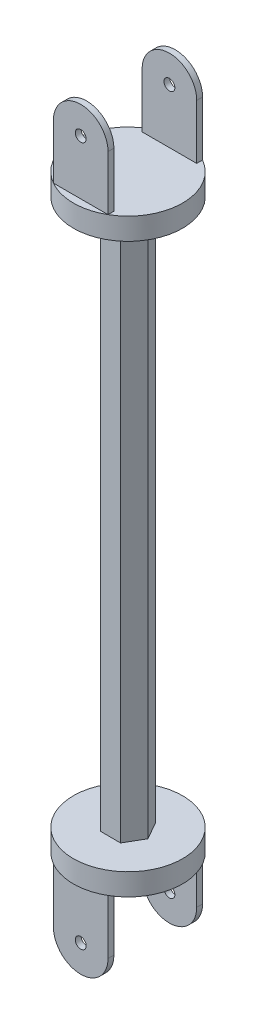
ISO-10303-21;
HEADER;
FILE_DESCRIPTION(('STEP AP214'),'2;1');
FILE_NAME('part.step','',(''),(''),'','','');
FILE_SCHEMA(('AUTOMOTIVE_DESIGN { 1 0 10303 214 1 1 1 1 }'));
ENDSEC;
DATA;
#1=APPLICATION_CONTEXT('core data for automotive mechanical design processes');
#2=APPLICATION_PROTOCOL_DEFINITION('international standard','automotive_design',2000,#1);
#3=PRODUCT_CONTEXT('',#1,'mechanical');
#4=PRODUCT('Part','Part','',(#3));
#5=PRODUCT_RELATED_PRODUCT_CATEGORY('part','',(#4));
#6=PRODUCT_DEFINITION_FORMATION('','',#4);
#7=PRODUCT_DEFINITION_CONTEXT('part definition',#1,'design');
#8=PRODUCT_DEFINITION('design','',#6,#7);
#9=PRODUCT_DEFINITION_SHAPE('','',#8);
#10=(LENGTH_UNIT() NAMED_UNIT(*) SI_UNIT(.MILLI.,.METRE.));
#11=(NAMED_UNIT(*) PLANE_ANGLE_UNIT() SI_UNIT($,.RADIAN.));
#12=(NAMED_UNIT(*) SI_UNIT($,.STERADIAN.) SOLID_ANGLE_UNIT());
#13=UNCERTAINTY_MEASURE_WITH_UNIT(LENGTH_MEASURE(1.E-05),#10,'distance_accuracy_value','');
#14=(GEOMETRIC_REPRESENTATION_CONTEXT(3) GLOBAL_UNCERTAINTY_ASSIGNED_CONTEXT((#13)) GLOBAL_UNIT_ASSIGNED_CONTEXT((#10,
#11,#12)) REPRESENTATION_CONTEXT('',''));
#15=CARTESIAN_POINT('',(0.,0.,0.));
#16=DIRECTION('',(0.,0.,1.));
#17=DIRECTION('',(1.,0.,0.));
#18=AXIS2_PLACEMENT_3D('',#15,#16,#17);
#19=CARTESIAN_POINT('',(0.,114.,-7.58489605585749));
#20=DIRECTION('',(0.,0.,1.));
#21=DIRECTION('',(1.,0.,0.));
#22=AXIS2_PLACEMENT_3D('',#19,#20,#21);
#23=CYLINDRICAL_SURFACE('',#22,5.);
#24=DIRECTION('',(0.,0.,-1.));
#25=VECTOR('',#24,1.);
#26=CARTESIAN_POINT('',(-5.,114.,-7.5848960558575));
#27=LINE('',#26,#25);
#28=CARTESIAN_POINT('',(-5.,114.,-7.58489605585749));
#29=VERTEX_POINT('',#28);
#30=CARTESIAN_POINT('',(-5.,114.,-8.66025403784439));
#31=VERTEX_POINT('',#30);
#32=EDGE_CURVE('E474',#29,#31,#27,.T.);
#33=ORIENTED_EDGE('',*,*,#32,.F.);
#34=CARTESIAN_POINT('',(0.,114.,-7.58489605585749));
#35=DIRECTION('',(0.,0.,-1.));
#36=DIRECTION('',(-1.,0.,0.));
#37=AXIS2_PLACEMENT_3D('',#34,#35,#36);
#38=CIRCLE('',#37,5.);
#39=CARTESIAN_POINT('',(5.,114.,-7.58489605585749));
#40=VERTEX_POINT('',#39);
#41=EDGE_CURVE('E56',#40,#29,#38,.F.);
#42=ORIENTED_EDGE('',*,*,#41,.F.);
#43=DIRECTION('',(0.,0.,-1.));
#44=VECTOR('',#43,1.);
#45=CARTESIAN_POINT('',(5.,114.,-7.5848960558575));
#46=LINE('',#45,#44);
#47=CARTESIAN_POINT('',(5.,114.,-8.66025403784439));
#48=VERTEX_POINT('',#47);
#49=EDGE_CURVE('E478',#48,#40,#46,.F.);
#50=ORIENTED_EDGE('',*,*,#49,.F.);
#51=CARTESIAN_POINT('',(0.,114.,-8.66025403784439));
#52=DIRECTION('',(0.,0.,1.));
#53=DIRECTION('',(1.,0.,0.));
#54=AXIS2_PLACEMENT_3D('',#51,#52,#53);
#55=CIRCLE('',#54,5.);
#56=EDGE_CURVE('E11',#31,#48,#55,.F.);
#57=ORIENTED_EDGE('',*,*,#56,.F.);
#58=EDGE_LOOP('',(#33,#42,#50,#57));
#59=FACE_BOUND('',#58,.T.);
#60=ADVANCED_FACE('F47',(#59),#23,.T.);
#61=CARTESIAN_POINT('',(0.,114.,8.66025403784439));
#62=DIRECTION('',(0.,0.,1.));
#63=DIRECTION('',(1.,0.,0.));
#64=AXIS2_PLACEMENT_3D('',#61,#62,#63);
#65=CYLINDRICAL_SURFACE('',#64,5.);
#66=DIRECTION('',(0.,0.,-1.));
#67=VECTOR('',#66,1.);
#68=CARTESIAN_POINT('',(-5.,114.,8.66025403784439));
#69=LINE('',#68,#67);
#70=CARTESIAN_POINT('',(-5.,114.,8.66025403784439));
#71=VERTEX_POINT('',#70);
#72=CARTESIAN_POINT('',(-5.,114.,7.58489605585749));
#73=VERTEX_POINT('',#72);
#74=EDGE_CURVE('E460',#71,#73,#69,.T.);
#75=ORIENTED_EDGE('',*,*,#74,.F.);
#76=CARTESIAN_POINT('',(0.,114.,8.66025403784439));
#77=DIRECTION('',(0.,0.,-1.));
#78=DIRECTION('',(-1.,0.,0.));
#79=AXIS2_PLACEMENT_3D('',#76,#77,#78);
#80=CIRCLE('',#79,5.);
#81=CARTESIAN_POINT('',(5.,114.,8.66025403784439));
#82=VERTEX_POINT('',#81);
#83=EDGE_CURVE('E468',#82,#71,#80,.F.);
#84=ORIENTED_EDGE('',*,*,#83,.F.);
#85=DIRECTION('',(0.,0.,-1.));
#86=VECTOR('',#85,1.);
#87=CARTESIAN_POINT('',(5.,114.,8.66025403784439));
#88=LINE('',#87,#86);
#89=CARTESIAN_POINT('',(5.,114.,7.58489605585749));
#90=VERTEX_POINT('',#89);
#91=EDGE_CURVE('E464',#90,#82,#88,.F.);
#92=ORIENTED_EDGE('',*,*,#91,.F.);
#93=CARTESIAN_POINT('',(0.,114.,7.58489605585749));
#94=DIRECTION('',(0.,0.,1.));
#95=DIRECTION('',(1.,0.,0.));
#96=AXIS2_PLACEMENT_3D('',#93,#94,#95);
#97=CIRCLE('',#96,5.);
#98=EDGE_CURVE('E471',#73,#90,#97,.F.);
#99=ORIENTED_EDGE('',*,*,#98,.F.);
#100=EDGE_LOOP('',(#75,#84,#92,#99));
#101=FACE_BOUND('',#100,.T.);
#102=ADVANCED_FACE('F568',(#101),#65,.T.);
#103=CARTESIAN_POINT('',(0.,104.,0.));
#104=DIRECTION('',(0.,1.,0.));
#105=DIRECTION('',(0.,0.,1.));
#106=AXIS2_PLACEMENT_3D('',#103,#104,#105);
#107=PLANE('',#106);
#108=DIRECTION('',(0.,0.,1.));
#109=VECTOR('',#108,1.);
#110=CARTESIAN_POINT('',(-5.,104.,-8.66025403784439));
#111=LINE('',#110,#109);
#112=CARTESIAN_POINT('',(-5.,104.,-8.66025403784439));
#113=VERTEX_POINT('',#112);
#114=CARTESIAN_POINT('',(-5.,104.,-7.58489605585749));
#115=VERTEX_POINT('',#114);
#116=EDGE_CURVE('E347',#113,#115,#111,.T.);
#117=ORIENTED_EDGE('',*,*,#116,.F.);
#118=CARTESIAN_POINT('',(0.,104.,0.));
#119=DIRECTION('',(0.,1.,0.));
#120=DIRECTION('',(0.,0.,1.));
#121=AXIS2_PLACEMENT_3D('',#118,#119,#120);
#122=CIRCLE('',#121,10.);
#123=CARTESIAN_POINT('',(-5.,104.,8.66025403784439));
#124=VERTEX_POINT('',#123);
#125=EDGE_CURVE('E494',#113,#124,#122,.T.);
#126=ORIENTED_EDGE('',*,*,#125,.T.);
#127=DIRECTION('',(0.,0.,1.));
#128=VECTOR('',#127,1.);
#129=CARTESIAN_POINT('',(-5.,104.,8.66025403784439));
#130=LINE('',#129,#128);
#131=CARTESIAN_POINT('',(-5.,104.,7.58489605585749));
#132=VERTEX_POINT('',#131);
#133=EDGE_CURVE('E388',#132,#124,#130,.T.);
#134=ORIENTED_EDGE('',*,*,#133,.F.);
#135=DIRECTION('',(-1.,0.,0.));
#136=VECTOR('',#135,1.);
#137=CARTESIAN_POINT('',(-5.,104.,7.58489605585749));
#138=LINE('',#137,#136);
#139=CARTESIAN_POINT('',(5.,104.,7.58489605585749));
#140=VERTEX_POINT('',#139);
#141=EDGE_CURVE('E392',#140,#132,#138,.T.);
#142=ORIENTED_EDGE('',*,*,#141,.F.);
#143=DIRECTION('',(0.,0.,-1.));
#144=VECTOR('',#143,1.);
#145=CARTESIAN_POINT('',(5.,104.,8.66025403784439));
#146=LINE('',#145,#144);
#147=CARTESIAN_POINT('',(5.,104.,8.66025403784439));
#148=VERTEX_POINT('',#147);
#149=EDGE_CURVE('E396',#148,#140,#146,.T.);
#150=ORIENTED_EDGE('',*,*,#149,.F.);
#151=CARTESIAN_POINT('',(5.,104.,-8.66025403784439));
#152=VERTEX_POINT('',#151);
#153=EDGE_CURVE('E403',#148,#152,#122,.T.);
#154=ORIENTED_EDGE('',*,*,#153,.T.);
#155=DIRECTION('',(0.,0.,-1.));
#156=VECTOR('',#155,1.);
#157=CARTESIAN_POINT('',(5.,104.,-8.66025403784439));
#158=LINE('',#157,#156);
#159=CARTESIAN_POINT('',(5.,104.,-7.58489605585749));
#160=VERTEX_POINT('',#159);
#161=EDGE_CURVE('E356',#160,#152,#158,.T.);
#162=ORIENTED_EDGE('',*,*,#161,.F.);
#163=DIRECTION('',(1.,0.,0.));
#164=VECTOR('',#163,1.);
#165=CARTESIAN_POINT('',(-5.,104.,-7.58489605585749));
#166=LINE('',#165,#164);
#167=EDGE_CURVE('E351',#115,#160,#166,.T.);
#168=ORIENTED_EDGE('',*,*,#167,.F.);
#169=EDGE_LOOP('',(#117,#126,#134,#142,#150,#154,#162,#168));
#170=FACE_BOUND('',#169,.T.);
#171=ADVANCED_FACE('F492',(#170),#107,.T.);
#172=DIRECTION('',(1.,0.,0.));
#173=VECTOR('',#172,1.);
#174=CARTESIAN_POINT('',(-5.,104.,8.66025403784439));
#175=LINE('',#174,#173);
#176=EDGE_CURVE('E352',#124,#148,#175,.T.);
#177=ORIENTED_EDGE('',*,*,#176,.F.);
#178=EDGE_CURVE('E409',#124,#148,#122,.T.);
#179=ORIENTED_EDGE('',*,*,#178,.T.);
#180=EDGE_LOOP('',(#177,#179));
#181=FACE_BOUND('',#180,.T.);
#182=ADVANCED_FACE('F521',(#181),#107,.T.);
#183=CARTESIAN_POINT('',(3.66615370564057,100.,0.0122613193097258));
#184=DIRECTION('',(-0.867692783065669,0.,0.497100829023403));
#185=DIRECTION('',(0.497100829023403,0.,0.867692783065669));
#186=AXIS2_PLACEMENT_3D('',#183,#184,#185);
#187=PLANE('',#186);
#188=DIRECTION('',(-0.497100829023403,0.,-0.867692783065669));
#189=VECTOR('',#188,1.);
#190=CARTESIAN_POINT('',(3.66615370564057,0.,0.0122613193097258));
#191=LINE('',#190,#189);
#192=CARTESIAN_POINT('',(3.66615370564057,0.,0.0122613193097258));
#193=VERTEX_POINT('',#192);
#194=CARTESIAN_POINT('',(1.84369546682642,0.,-3.16885158360833));
#195=VERTEX_POINT('',#194);
#196=EDGE_CURVE('E272',#193,#195,#191,.T.);
#197=ORIENTED_EDGE('',*,*,#196,.T.);
#198=DIRECTION('',(0.,-1.,0.));
#199=VECTOR('',#198,1.);
#200=CARTESIAN_POINT('',(1.84369546682642,100.,-3.16885158360833));
#201=LINE('',#200,#199);
#202=CARTESIAN_POINT('',(1.84369546682642,100.,-3.16885158360833));
#203=VERTEX_POINT('',#202);
#204=EDGE_CURVE('E456',#203,#195,#201,.T.);
#205=ORIENTED_EDGE('',*,*,#204,.F.);
#206=DIRECTION('',(-0.497100829023403,0.,-0.867692783065669));
#207=VECTOR('',#206,1.);
#208=CARTESIAN_POINT('',(3.66615370564057,100.,0.0122613193097258));
#209=LINE('',#208,#207);
#210=CARTESIAN_POINT('',(3.66615370564057,100.,0.0122613193097258));
#211=VERTEX_POINT('',#210);
#212=EDGE_CURVE('E407',#211,#203,#209,.T.);
#213=ORIENTED_EDGE('',*,*,#212,.F.);
#214=DIRECTION('',(0.,-1.,0.));
#215=VECTOR('',#214,1.);
#216=CARTESIAN_POINT('',(3.66615370564057,100.,0.0122613193097258));
#217=LINE('',#216,#215);
#218=EDGE_CURVE('E436',#211,#193,#217,.T.);
#219=ORIENTED_EDGE('',*,*,#218,.T.);
#220=EDGE_LOOP('',(#197,#205,#213,#219));
#221=FACE_BOUND('',#220,.T.);
#222=ADVANCED_FACE('F585',(#221),#187,.F.);
#223=CARTESIAN_POINT('',(1.84369546682642,100.,-3.16885158360833));
#224=DIRECTION('',(-0.00334444535626305,0.,0.99999440732699));
#225=DIRECTION('',(0.999994407326991,0.,0.00334444535626305));
#226=AXIS2_PLACEMENT_3D('',#223,#224,#225);
#227=PLANE('',#226);
#228=DIRECTION('',(-0.999994407326991,0.,-0.00334444535626305));
#229=VECTOR('',#228,1.);
#230=CARTESIAN_POINT('',(1.84369546682642,0.,-3.16885158360833));
#231=LINE('',#230,#229);
#232=CARTESIAN_POINT('',(-1.82245823881415,0.,-3.18111290291806));
#233=VERTEX_POINT('',#232);
#234=EDGE_CURVE('E281',#195,#233,#231,.T.);
#235=ORIENTED_EDGE('',*,*,#234,.T.);
#236=DIRECTION('',(0.,-1.,0.));
#237=VECTOR('',#236,1.);
#238=CARTESIAN_POINT('',(-1.82245823881415,100.,-3.18111290291806));
#239=LINE('',#238,#237);
#240=CARTESIAN_POINT('',(-1.82245823881415,100.,-3.18111290291806));
#241=VERTEX_POINT('',#240);
#242=EDGE_CURVE('E452',#241,#233,#239,.T.);
#243=ORIENTED_EDGE('',*,*,#242,.F.);
#244=DIRECTION('',(-0.999994407326991,0.,-0.00334444535626305));
#245=VECTOR('',#244,1.);
#246=CARTESIAN_POINT('',(1.84369546682642,100.,-3.16885158360833));
#247=LINE('',#246,#245);
#248=EDGE_CURVE('E416',#203,#241,#247,.T.);
#249=ORIENTED_EDGE('',*,*,#248,.F.);
#250=ORIENTED_EDGE('',*,*,#204,.T.);
#251=EDGE_LOOP('',(#235,#243,#249,#250));
#252=FACE_BOUND('',#251,.T.);
#253=ADVANCED_FACE('F588',(#252),#227,.F.);
#254=CARTESIAN_POINT('',(-1.82245823881415,100.,-3.18111290291806));
#255=DIRECTION('',(0.864348337709406,0.,0.502893578303588));
#256=DIRECTION('',(0.502893578303588,0.,-0.864348337709406));
#257=AXIS2_PLACEMENT_3D('',#254,#255,#256);
#258=PLANE('',#257);
#259=DIRECTION('',(-0.502893578303588,0.,0.864348337709406));
#260=VECTOR('',#259,1.);
#261=CARTESIAN_POINT('',(-1.82245823881415,0.,-3.18111290291806));
#262=LINE('',#261,#260);
#263=CARTESIAN_POINT('',(-3.66615370564057,0.,-0.0122613193097262));
#264=VERTEX_POINT('',#263);
#265=EDGE_CURVE('E285',#233,#264,#262,.T.);
#266=ORIENTED_EDGE('',*,*,#265,.T.);
#267=DIRECTION('',(0.,-1.,0.));
#268=VECTOR('',#267,1.);
#269=CARTESIAN_POINT('',(-3.66615370564057,100.,-0.0122613193097262));
#270=LINE('',#269,#268);
#271=CARTESIAN_POINT('',(-3.66615370564057,100.,-0.0122613193097262));
#272=VERTEX_POINT('',#271);
#273=EDGE_CURVE('E448',#272,#264,#270,.T.);
#274=ORIENTED_EDGE('',*,*,#273,.F.);
#275=DIRECTION('',(-0.502893578303588,0.,0.864348337709406));
#276=VECTOR('',#275,1.);
#277=CARTESIAN_POINT('',(-1.82245823881415,100.,-3.18111290291806));
#278=LINE('',#277,#276);
#279=EDGE_CURVE('E420',#241,#272,#278,.T.);
#280=ORIENTED_EDGE('',*,*,#279,.F.);
#281=ORIENTED_EDGE('',*,*,#242,.T.);
#282=EDGE_LOOP('',(#266,#274,#280,#281));
#283=FACE_BOUND('',#282,.T.);
#284=ADVANCED_FACE('F592',(#283),#258,.F.);
#285=CARTESIAN_POINT('',(-3.66615370564057,100.,-0.0122613193097262));
#286=DIRECTION('',(0.867692783065669,0.,-0.497100829023403));
#287=DIRECTION('',(-0.497100829023403,0.,-0.867692783065669));
#288=AXIS2_PLACEMENT_3D('',#285,#286,#287);
#289=PLANE('',#288);
#290=DIRECTION('',(0.497100829023403,0.,0.867692783065669));
#291=VECTOR('',#290,1.);
#292=CARTESIAN_POINT('',(-3.66615370564057,0.,-0.0122613193097262));
#293=LINE('',#292,#291);
#294=CARTESIAN_POINT('',(-1.84369546682642,0.,3.16885158360833));
#295=VERTEX_POINT('',#294);
#296=EDGE_CURVE('E289',#264,#295,#293,.T.);
#297=ORIENTED_EDGE('',*,*,#296,.T.);
#298=DIRECTION('',(0.,-1.,0.));
#299=VECTOR('',#298,1.);
#300=CARTESIAN_POINT('',(-1.84369546682642,100.,3.16885158360833));
#301=LINE('',#300,#299);
#302=CARTESIAN_POINT('',(-1.84369546682642,100.,3.16885158360833));
#303=VERTEX_POINT('',#302);
#304=EDGE_CURVE('E444',#303,#295,#301,.T.);
#305=ORIENTED_EDGE('',*,*,#304,.F.);
#306=DIRECTION('',(0.497100829023403,0.,0.867692783065669));
#307=VECTOR('',#306,1.);
#308=CARTESIAN_POINT('',(-3.66615370564057,100.,-0.0122613193097262));
#309=LINE('',#308,#307);
#310=EDGE_CURVE('E424',#272,#303,#309,.T.);
#311=ORIENTED_EDGE('',*,*,#310,.F.);
#312=ORIENTED_EDGE('',*,*,#273,.T.);
#313=EDGE_LOOP('',(#297,#305,#311,#312));
#314=FACE_BOUND('',#313,.T.);
#315=ADVANCED_FACE('F596',(#314),#289,.F.);
#316=CARTESIAN_POINT('',(-1.84369546682642,100.,3.16885158360833));
#317=DIRECTION('',(0.00334444535626281,0.,-0.999994407326991));
#318=DIRECTION('',(-0.999994407326991,0.,-0.00334444535626281));
#319=AXIS2_PLACEMENT_3D('',#316,#317,#318);
#320=PLANE('',#319);
#321=DIRECTION('',(0.99999440732699,0.,0.00334444535626281));
#322=VECTOR('',#321,1.);
#323=CARTESIAN_POINT('',(-1.84369546682642,0.,3.16885158360833));
#324=LINE('',#323,#322);
#325=CARTESIAN_POINT('',(1.82245823881415,0.,3.18111290291806));
#326=VERTEX_POINT('',#325);
#327=EDGE_CURVE('E293',#295,#326,#324,.T.);
#328=ORIENTED_EDGE('',*,*,#327,.T.);
#329=DIRECTION('',(0.,-1.,0.));
#330=VECTOR('',#329,1.);
#331=CARTESIAN_POINT('',(1.82245823881415,100.,3.18111290291806));
#332=LINE('',#331,#330);
#333=CARTESIAN_POINT('',(1.82245823881415,100.,3.18111290291806));
#334=VERTEX_POINT('',#333);
#335=EDGE_CURVE('E440',#334,#326,#332,.T.);
#336=ORIENTED_EDGE('',*,*,#335,.F.);
#337=DIRECTION('',(0.99999440732699,0.,0.00334444535626281));
#338=VECTOR('',#337,1.);
#339=CARTESIAN_POINT('',(-1.84369546682642,100.,3.16885158360833));
#340=LINE('',#339,#338);
#341=EDGE_CURVE('E428',#303,#334,#340,.T.);
#342=ORIENTED_EDGE('',*,*,#341,.F.);
#343=ORIENTED_EDGE('',*,*,#304,.T.);
#344=EDGE_LOOP('',(#328,#336,#342,#343));
#345=FACE_BOUND('',#344,.T.);
#346=ADVANCED_FACE('F600',(#345),#320,.F.);
#347=CARTESIAN_POINT('',(1.82245823881415,100.,3.18111290291806));
#348=DIRECTION('',(-0.864348337709406,0.,-0.502893578303588));
#349=DIRECTION('',(-0.502893578303588,0.,0.864348337709406));
#350=AXIS2_PLACEMENT_3D('',#347,#348,#349);
#351=PLANE('',#350);
#352=DIRECTION('',(0.502893578303588,0.,-0.864348337709406));
#353=VECTOR('',#352,1.);
#354=CARTESIAN_POINT('',(1.82245823881415,0.,3.18111290291806));
#355=LINE('',#354,#353);
#356=EDGE_CURVE('E297',#326,#193,#355,.T.);
#357=ORIENTED_EDGE('',*,*,#356,.T.);
#358=ORIENTED_EDGE('',*,*,#218,.F.);
#359=DIRECTION('',(0.502893578303588,0.,-0.864348337709406));
#360=VECTOR('',#359,1.);
#361=CARTESIAN_POINT('',(1.82245823881415,100.,3.18111290291806));
#362=LINE('',#361,#360);
#363=EDGE_CURVE('E432',#334,#211,#362,.T.);
#364=ORIENTED_EDGE('',*,*,#363,.F.);
#365=ORIENTED_EDGE('',*,*,#335,.T.);
#366=EDGE_LOOP('',(#357,#358,#364,#365));
#367=FACE_BOUND('',#366,.T.);
#368=ADVANCED_FACE('F604',(#367),#351,.F.);
#369=CARTESIAN_POINT('',(0.,100.,0.));
#370=DIRECTION('',(0.,1.,0.));
#371=DIRECTION('',(0.,0.,1.));
#372=AXIS2_PLACEMENT_3D('',#369,#370,#371);
#373=PLANE('',#372);
#374=CARTESIAN_POINT('',(0.,100.,0.));
#375=DIRECTION('',(0.,1.,0.));
#376=DIRECTION('',(0.,0.,1.));
#377=AXIS2_PLACEMENT_3D('',#374,#375,#376);
#378=CIRCLE('',#377,10.);
#379=CARTESIAN_POINT('',(0.,100.,10.));
#380=VERTEX_POINT('',#379);
#381=EDGE_CURVE('E376',#380,#380,#378,.T.);
#382=ORIENTED_EDGE('',*,*,#381,.F.);
#383=EDGE_LOOP('',(#382));
#384=FACE_BOUND('',#383,.T.);
#385=ORIENTED_EDGE('',*,*,#363,.T.);
#386=ORIENTED_EDGE('',*,*,#212,.T.);
#387=ORIENTED_EDGE('',*,*,#248,.T.);
#388=ORIENTED_EDGE('',*,*,#279,.T.);
#389=ORIENTED_EDGE('',*,*,#310,.T.);
#390=ORIENTED_EDGE('',*,*,#341,.T.);
#391=EDGE_LOOP('',(#385,#386,#387,#388,#389,#390));
#392=FACE_BOUND('',#391,.T.);
#393=ADVANCED_FACE('F608',(#384,#392),#373,.F.);
#394=CARTESIAN_POINT('',(0.,104.,0.));
#395=DIRECTION('',(0.,-1.,0.));
#396=DIRECTION('',(0.,0.,-1.));
#397=AXIS2_PLACEMENT_3D('',#394,#395,#396);
#398=CYLINDRICAL_SURFACE('',#397,10.);
#399=ORIENTED_EDGE('',*,*,#153,.F.);
#400=ORIENTED_EDGE('',*,*,#178,.F.);
#401=ORIENTED_EDGE('',*,*,#125,.F.);
#402=EDGE_CURVE('E408',#152,#113,#122,.T.);
#403=ORIENTED_EDGE('',*,*,#402,.F.);
#404=EDGE_LOOP('',(#399,#400,#401,#403));
#405=FACE_BOUND('',#404,.T.);
#406=ORIENTED_EDGE('',*,*,#381,.T.);
#407=EDGE_LOOP('',(#406));
#408=FACE_BOUND('',#407,.T.);
#409=ADVANCED_FACE('F501',(#405,#408),#398,.T.);
#410=DIRECTION('',(-1.,0.,0.));
#411=VECTOR('',#410,1.);
#412=CARTESIAN_POINT('',(-5.,104.,-8.66025403784439));
#413=LINE('',#412,#411);
#414=EDGE_CURVE('E360',#152,#113,#413,.T.);
#415=ORIENTED_EDGE('',*,*,#414,.F.);
#416=ORIENTED_EDGE('',*,*,#402,.T.);
#417=EDGE_LOOP('',(#415,#416));
#418=FACE_BOUND('',#417,.T.);
#419=ADVANCED_FACE('F507',(#418),#107,.T.);
#420=CARTESIAN_POINT('',(-5.,119.,8.66025403784439));
#421=DIRECTION('',(0.,0.,-1.));
#422=DIRECTION('',(-1.,0.,0.));
#423=AXIS2_PLACEMENT_3D('',#420,#421,#422);
#424=PLANE('',#423);
#425=CARTESIAN_POINT('',(0.,114.,8.66025403784439));
#426=DIRECTION('',(0.,0.,1.));
#427=DIRECTION('',(1.,0.,0.));
#428=AXIS2_PLACEMENT_3D('',#425,#426,#427);
#429=CIRCLE('',#428,1.);
#430=CARTESIAN_POINT('',(1.,114.,8.66025403784439));
#431=VERTEX_POINT('',#430);
#432=EDGE_CURVE('E330',#431,#431,#429,.T.);
#433=ORIENTED_EDGE('',*,*,#432,.F.);
#434=EDGE_LOOP('',(#433));
#435=FACE_BOUND('',#434,.T.);
#436=DIRECTION('',(0.,-1.,0.));
#437=VECTOR('',#436,1.);
#438=CARTESIAN_POINT('',(5.,119.,8.66025403784439));
#439=LINE('',#438,#437);
#440=EDGE_CURVE('E346',#82,#148,#439,.T.);
#441=ORIENTED_EDGE('',*,*,#440,.F.);
#442=ORIENTED_EDGE('',*,*,#83,.T.);
#443=DIRECTION('',(0.,-1.,0.));
#444=VECTOR('',#443,1.);
#445=CARTESIAN_POINT('',(-5.,119.,8.66025403784439));
#446=LINE('',#445,#444);
#447=EDGE_CURVE('E385',#71,#124,#446,.T.);
#448=ORIENTED_EDGE('',*,*,#447,.T.);
#449=ORIENTED_EDGE('',*,*,#176,.T.);
#450=EDGE_LOOP('',(#441,#442,#448,#449));
#451=FACE_BOUND('',#450,.T.);
#452=ADVANCED_FACE('F518',(#435,#451),#424,.F.);
#453=CARTESIAN_POINT('',(5.,119.,8.66025403784439));
#454=DIRECTION('',(-1.,0.,0.));
#455=DIRECTION('',(0.,0.,1.));
#456=AXIS2_PLACEMENT_3D('',#453,#454,#455);
#457=PLANE('',#456);
#458=DIRECTION('',(0.,-1.,0.));
#459=VECTOR('',#458,1.);
#460=CARTESIAN_POINT('',(5.,119.,7.58489605585749));
#461=LINE('',#460,#459);
#462=EDGE_CURVE('E379',#90,#140,#461,.T.);
#463=ORIENTED_EDGE('',*,*,#462,.F.);
#464=ORIENTED_EDGE('',*,*,#91,.T.);
#465=ORIENTED_EDGE('',*,*,#440,.T.);
#466=ORIENTED_EDGE('',*,*,#149,.T.);
#467=EDGE_LOOP('',(#463,#464,#465,#466));
#468=FACE_BOUND('',#467,.T.);
#469=ADVANCED_FACE('F623',(#468),#457,.F.);
#470=CARTESIAN_POINT('',(-5.,119.,7.58489605585749));
#471=DIRECTION('',(0.,0.,1.));
#472=DIRECTION('',(1.,0.,0.));
#473=AXIS2_PLACEMENT_3D('',#470,#471,#472);
#474=PLANE('',#473);
#475=CARTESIAN_POINT('',(0.,114.,7.58489605585749));
#476=DIRECTION('',(0.,0.,1.));
#477=DIRECTION('',(1.,0.,0.));
#478=AXIS2_PLACEMENT_3D('',#475,#476,#477);
#479=CIRCLE('',#478,1.);
#480=CARTESIAN_POINT('',(1.,114.,7.58489605585749));
#481=VERTEX_POINT('',#480);
#482=EDGE_CURVE('E342',#481,#481,#479,.T.);
#483=ORIENTED_EDGE('',*,*,#482,.T.);
#484=EDGE_LOOP('',(#483));
#485=FACE_BOUND('',#484,.T.);
#486=DIRECTION('',(0.,-1.,0.));
#487=VECTOR('',#486,1.);
#488=CARTESIAN_POINT('',(-5.,119.,7.58489605585749));
#489=LINE('',#488,#487);
#490=EDGE_CURVE('E382',#73,#132,#489,.T.);
#491=ORIENTED_EDGE('',*,*,#490,.F.);
#492=ORIENTED_EDGE('',*,*,#98,.T.);
#493=ORIENTED_EDGE('',*,*,#462,.T.);
#494=ORIENTED_EDGE('',*,*,#141,.T.);
#495=EDGE_LOOP('',(#491,#492,#493,#494));
#496=FACE_BOUND('',#495,.T.);
#497=ADVANCED_FACE('F619',(#485,#496),#474,.F.);
#498=CARTESIAN_POINT('',(-5.,119.,8.66025403784439));
#499=DIRECTION('',(1.,0.,0.));
#500=DIRECTION('',(0.,0.,-1.));
#501=AXIS2_PLACEMENT_3D('',#498,#499,#500);
#502=PLANE('',#501);
#503=ORIENTED_EDGE('',*,*,#447,.F.);
#504=ORIENTED_EDGE('',*,*,#74,.T.);
#505=ORIENTED_EDGE('',*,*,#490,.T.);
#506=ORIENTED_EDGE('',*,*,#133,.T.);
#507=EDGE_LOOP('',(#503,#504,#505,#506));
#508=FACE_BOUND('',#507,.T.);
#509=ADVANCED_FACE('F616',(#508),#502,.F.);
#510=CARTESIAN_POINT('',(-5.,119.,-8.66025403784439));
#511=DIRECTION('',(1.,0.,0.));
#512=DIRECTION('',(0.,0.,-1.));
#513=AXIS2_PLACEMENT_3D('',#510,#511,#512);
#514=PLANE('',#513);
#515=DIRECTION('',(0.,-1.,0.));
#516=VECTOR('',#515,1.);
#517=CARTESIAN_POINT('',(-5.,119.,-7.58489605585749));
#518=LINE('',#517,#516);
#519=EDGE_CURVE('E373',#29,#115,#518,.T.);
#520=ORIENTED_EDGE('',*,*,#519,.F.);
#521=ORIENTED_EDGE('',*,*,#32,.T.);
#522=DIRECTION('',(0.,-1.,0.));
#523=VECTOR('',#522,1.);
#524=CARTESIAN_POINT('',(-5.,119.,-8.66025403784439));
#525=LINE('',#524,#523);
#526=EDGE_CURVE('E364',#31,#113,#525,.T.);
#527=ORIENTED_EDGE('',*,*,#526,.T.);
#528=ORIENTED_EDGE('',*,*,#116,.T.);
#529=EDGE_LOOP('',(#520,#521,#527,#528));
#530=FACE_BOUND('',#529,.T.);
#531=ADVANCED_FACE('F487',(#530),#514,.F.);
#532=CARTESIAN_POINT('',(-5.,119.,-7.58489605585749));
#533=DIRECTION('',(0.,0.,-1.));
#534=DIRECTION('',(-1.,0.,0.));
#535=AXIS2_PLACEMENT_3D('',#532,#533,#534);
#536=PLANE('',#535);
#537=CARTESIAN_POINT('',(0.,114.,-7.58489605585749));
#538=DIRECTION('',(0.,0.,-1.));
#539=DIRECTION('',(-1.,0.,0.));
#540=AXIS2_PLACEMENT_3D('',#537,#538,#539);
#541=CIRCLE('',#540,1.);
#542=CARTESIAN_POINT('',(-1.,114.,-7.58489605585749));
#543=VERTEX_POINT('',#542);
#544=EDGE_CURVE('E338',#543,#543,#541,.T.);
#545=ORIENTED_EDGE('',*,*,#544,.T.);
#546=EDGE_LOOP('',(#545));
#547=FACE_BOUND('',#546,.T.);
#548=DIRECTION('',(0.,-1.,0.));
#549=VECTOR('',#548,1.);
#550=CARTESIAN_POINT('',(5.,119.,-7.58489605585749));
#551=LINE('',#550,#549);
#552=EDGE_CURVE('E370',#40,#160,#551,.T.);
#553=ORIENTED_EDGE('',*,*,#552,.F.);
#554=ORIENTED_EDGE('',*,*,#41,.T.);
#555=ORIENTED_EDGE('',*,*,#519,.T.);
#556=ORIENTED_EDGE('',*,*,#167,.T.);
#557=EDGE_LOOP('',(#553,#554,#555,#556));
#558=FACE_BOUND('',#557,.T.);
#559=ADVANCED_FACE('F483',(#547,#558),#536,.F.);
#560=CARTESIAN_POINT('',(5.,119.,-8.66025403784439));
#561=DIRECTION('',(-1.,0.,0.));
#562=DIRECTION('',(0.,0.,1.));
#563=AXIS2_PLACEMENT_3D('',#560,#561,#562);
#564=PLANE('',#563);
#565=DIRECTION('',(0.,-1.,0.));
#566=VECTOR('',#565,1.);
#567=CARTESIAN_POINT('',(5.,119.,-8.66025403784439));
#568=LINE('',#567,#566);
#569=EDGE_CURVE('E367',#48,#152,#568,.T.);
#570=ORIENTED_EDGE('',*,*,#569,.F.);
#571=ORIENTED_EDGE('',*,*,#49,.T.);
#572=ORIENTED_EDGE('',*,*,#552,.T.);
#573=ORIENTED_EDGE('',*,*,#161,.T.);
#574=EDGE_LOOP('',(#570,#571,#572,#573));
#575=FACE_BOUND('',#574,.T.);
#576=ADVANCED_FACE('F512',(#575),#564,.F.);
#577=CARTESIAN_POINT('',(-5.,119.,-8.66025403784439));
#578=DIRECTION('',(0.,0.,1.));
#579=DIRECTION('',(1.,0.,0.));
#580=AXIS2_PLACEMENT_3D('',#577,#578,#579);
#581=PLANE('',#580);
#582=CARTESIAN_POINT('',(0.,114.,-8.66025403784439));
#583=DIRECTION('',(0.,0.,1.));
#584=DIRECTION('',(1.,0.,0.));
#585=AXIS2_PLACEMENT_3D('',#582,#583,#584);
#586=CIRCLE('',#585,1.);
#587=CARTESIAN_POINT('',(1.,114.,-8.66025403784439));
#588=VERTEX_POINT('',#587);
#589=EDGE_CURVE('E334',#588,#588,#586,.F.);
#590=ORIENTED_EDGE('',*,*,#589,.F.);
#591=EDGE_LOOP('',(#590));
#592=FACE_BOUND('',#591,.T.);
#593=ORIENTED_EDGE('',*,*,#526,.F.);
#594=ORIENTED_EDGE('',*,*,#56,.T.);
#595=ORIENTED_EDGE('',*,*,#569,.T.);
#596=ORIENTED_EDGE('',*,*,#414,.T.);
#597=EDGE_LOOP('',(#593,#594,#595,#596));
#598=FACE_BOUND('',#597,.T.);
#599=ADVANCED_FACE('F509',(#592,#598),#581,.F.);
#600=CARTESIAN_POINT('',(0.,114.,-11.4886811625906));
#601=DIRECTION('',(0.,0.,1.));
#602=DIRECTION('',(1.,0.,0.));
#603=AXIS2_PLACEMENT_3D('',#600,#601,#602);
#604=CYLINDRICAL_SURFACE('',#603,1.);
#605=ORIENTED_EDGE('',*,*,#589,.T.);
#606=EDGE_LOOP('',(#605));
#607=FACE_BOUND('',#606,.T.);
#608=ORIENTED_EDGE('',*,*,#544,.F.);
#609=EDGE_LOOP('',(#608));
#610=FACE_BOUND('',#609,.T.);
#611=ADVANCED_FACE('F640',(#607,#610),#604,.F.);
#612=ORIENTED_EDGE('',*,*,#432,.T.);
#613=EDGE_LOOP('',(#612));
#614=FACE_BOUND('',#613,.T.);
#615=ORIENTED_EDGE('',*,*,#482,.F.);
#616=EDGE_LOOP('',(#615));
#617=FACE_BOUND('',#616,.T.);
#618=ADVANCED_FACE('F563',(#614,#617),#604,.F.);
#619=CARTESIAN_POINT('',(0.,-14.,-7.58489605585749));
#620=DIRECTION('',(0.,0.,1.));
#621=DIRECTION('',(1.,0.,0.));
#622=AXIS2_PLACEMENT_3D('',#619,#620,#621);
#623=CYLINDRICAL_SURFACE('',#622,5.);
#624=DIRECTION('',(0.,0.,-1.));
#625=VECTOR('',#624,1.);
#626=CARTESIAN_POINT('',(-5.,-14.,-7.5848960558575));
#627=LINE('',#626,#625);
#628=CARTESIAN_POINT('',(-5.,-14.,-7.58489605585749));
#629=VERTEX_POINT('',#628);
#630=CARTESIAN_POINT('',(-5.,-14.,-8.66025403784439));
#631=VERTEX_POINT('',#630);
#632=EDGE_CURVE('E317',#629,#631,#627,.T.);
#633=ORIENTED_EDGE('',*,*,#632,.T.);
#634=CARTESIAN_POINT('',(0.,-14.,-8.66025403784439));
#635=DIRECTION('',(0.,0.,-1.));
#636=DIRECTION('',(1.,0.,0.));
#637=AXIS2_PLACEMENT_3D('',#634,#635,#636);
#638=CIRCLE('',#637,5.);
#639=CARTESIAN_POINT('',(5.,-14.,-8.66025403784439));
#640=VERTEX_POINT('',#639);
#641=EDGE_CURVE('E326',#631,#640,#638,.F.);
#642=ORIENTED_EDGE('',*,*,#641,.T.);
#643=DIRECTION('',(0.,0.,-1.));
#644=VECTOR('',#643,1.);
#645=CARTESIAN_POINT('',(5.,-14.,-7.5848960558575));
#646=LINE('',#645,#644);
#647=CARTESIAN_POINT('',(5.,-14.,-7.58489605585749));
#648=VERTEX_POINT('',#647);
#649=EDGE_CURVE('E321',#640,#648,#646,.F.);
#650=ORIENTED_EDGE('',*,*,#649,.T.);
#651=CARTESIAN_POINT('',(0.,-14.,-7.58489605585749));
#652=DIRECTION('',(0.,0.,1.));
#653=DIRECTION('',(-1.,0.,0.));
#654=AXIS2_PLACEMENT_3D('',#651,#652,#653);
#655=CIRCLE('',#654,5.);
#656=EDGE_CURVE('E201',#648,#629,#655,.F.);
#657=ORIENTED_EDGE('',*,*,#656,.T.);
#658=EDGE_LOOP('',(#633,#642,#650,#657));
#659=FACE_BOUND('',#658,.T.);
#660=ADVANCED_FACE('F555',(#659),#623,.T.);
#661=CARTESIAN_POINT('',(0.,-14.,8.66025403784439));
#662=DIRECTION('',(0.,0.,1.));
#663=DIRECTION('',(1.,0.,0.));
#664=AXIS2_PLACEMENT_3D('',#661,#662,#663);
#665=CYLINDRICAL_SURFACE('',#664,5.);
#666=DIRECTION('',(0.,0.,-1.));
#667=VECTOR('',#666,1.);
#668=CARTESIAN_POINT('',(-5.,-14.,8.66025403784439));
#669=LINE('',#668,#667);
#670=CARTESIAN_POINT('',(-5.,-14.,8.66025403784439));
#671=VERTEX_POINT('',#670);
#672=CARTESIAN_POINT('',(-5.,-14.,7.58489605585749));
#673=VERTEX_POINT('',#672);
#674=EDGE_CURVE('E301',#671,#673,#669,.T.);
#675=ORIENTED_EDGE('',*,*,#674,.T.);
#676=CARTESIAN_POINT('',(0.,-14.,7.58489605585749));
#677=DIRECTION('',(0.,0.,-1.));
#678=DIRECTION('',(1.,0.,0.));
#679=AXIS2_PLACEMENT_3D('',#676,#677,#678);
#680=CIRCLE('',#679,5.);
#681=CARTESIAN_POINT('',(5.,-14.,7.58489605585749));
#682=VERTEX_POINT('',#681);
#683=EDGE_CURVE('E313',#673,#682,#680,.F.);
#684=ORIENTED_EDGE('',*,*,#683,.T.);
#685=DIRECTION('',(0.,0.,-1.));
#686=VECTOR('',#685,1.);
#687=CARTESIAN_POINT('',(5.,-14.,8.66025403784439));
#688=LINE('',#687,#686);
#689=CARTESIAN_POINT('',(5.,-14.,8.66025403784439));
#690=VERTEX_POINT('',#689);
#691=EDGE_CURVE('E305',#682,#690,#688,.F.);
#692=ORIENTED_EDGE('',*,*,#691,.T.);
#693=CARTESIAN_POINT('',(0.,-14.,8.66025403784439));
#694=DIRECTION('',(0.,0.,1.));
#695=DIRECTION('',(-1.,0.,0.));
#696=AXIS2_PLACEMENT_3D('',#693,#694,#695);
#697=CIRCLE('',#696,5.);
#698=EDGE_CURVE('E309',#690,#671,#697,.F.);
#699=ORIENTED_EDGE('',*,*,#698,.T.);
#700=EDGE_LOOP('',(#675,#684,#692,#699));
#701=FACE_BOUND('',#700,.T.);
#702=ADVANCED_FACE('F553',(#701),#665,.T.);
#703=CARTESIAN_POINT('',(0.,-4.,0.));
#704=DIRECTION('',(0.,-1.,0.));
#705=DIRECTION('',(0.,0.,1.));
#706=AXIS2_PLACEMENT_3D('',#703,#704,#705);
#707=PLANE('',#706);
#708=DIRECTION('',(0.,0.,1.));
#709=VECTOR('',#708,1.);
#710=CARTESIAN_POINT('',(-5.,-4.,-8.66025403784439));
#711=LINE('',#710,#709);
#712=CARTESIAN_POINT('',(-5.,-4.,-8.66025403784439));
#713=VERTEX_POINT('',#712);
#714=CARTESIAN_POINT('',(-5.,-4.,-7.58489605585749));
#715=VERTEX_POINT('',#714);
#716=EDGE_CURVE('E221',#713,#715,#711,.T.);
#717=ORIENTED_EDGE('',*,*,#716,.T.);
#718=DIRECTION('',(1.,0.,0.));
#719=VECTOR('',#718,1.);
#720=CARTESIAN_POINT('',(-5.,-4.,-7.58489605585749));
#721=LINE('',#720,#719);
#722=CARTESIAN_POINT('',(5.,-4.,-7.58489605585749));
#723=VERTEX_POINT('',#722);
#724=EDGE_CURVE('E198',#715,#723,#721,.T.);
#725=ORIENTED_EDGE('',*,*,#724,.T.);
#726=DIRECTION('',(0.,0.,-1.));
#727=VECTOR('',#726,1.);
#728=CARTESIAN_POINT('',(5.,-4.,-8.66025403784439));
#729=LINE('',#728,#727);
#730=CARTESIAN_POINT('',(5.,-4.,-8.66025403784439));
#731=VERTEX_POINT('',#730);
#732=EDGE_CURVE('E210',#723,#731,#729,.T.);
#733=ORIENTED_EDGE('',*,*,#732,.T.);
#734=CARTESIAN_POINT('',(0.,-4.,0.));
#735=DIRECTION('',(0.,1.,0.));
#736=DIRECTION('',(0.,0.,1.));
#737=AXIS2_PLACEMENT_3D('',#734,#735,#736);
#738=CIRCLE('',#737,10.);
#739=CARTESIAN_POINT('',(5.,-4.,8.66025403784439));
#740=VERTEX_POINT('',#739);
#741=EDGE_CURVE('E268',#740,#731,#738,.T.);
#742=ORIENTED_EDGE('',*,*,#741,.F.);
#743=DIRECTION('',(0.,0.,-1.));
#744=VECTOR('',#743,1.);
#745=CARTESIAN_POINT('',(5.,-4.,8.66025403784439));
#746=LINE('',#745,#744);
#747=CARTESIAN_POINT('',(5.,-4.,7.58489605585749));
#748=VERTEX_POINT('',#747);
#749=EDGE_CURVE('E261',#740,#748,#746,.T.);
#750=ORIENTED_EDGE('',*,*,#749,.T.);
#751=DIRECTION('',(-1.,0.,0.));
#752=VECTOR('',#751,1.);
#753=CARTESIAN_POINT('',(-5.,-4.,7.58489605585749));
#754=LINE('',#753,#752);
#755=CARTESIAN_POINT('',(-5.,-4.,7.58489605585749));
#756=VERTEX_POINT('',#755);
#757=EDGE_CURVE('E257',#748,#756,#754,.T.);
#758=ORIENTED_EDGE('',*,*,#757,.T.);
#759=DIRECTION('',(0.,0.,1.));
#760=VECTOR('',#759,1.);
#761=CARTESIAN_POINT('',(-5.,-4.,8.66025403784439));
#762=LINE('',#761,#760);
#763=CARTESIAN_POINT('',(-5.,-4.,8.66025403784439));
#764=VERTEX_POINT('',#763);
#765=EDGE_CURVE('E253',#756,#764,#762,.T.);
#766=ORIENTED_EDGE('',*,*,#765,.T.);
#767=EDGE_CURVE('E526',#713,#764,#738,.T.);
#768=ORIENTED_EDGE('',*,*,#767,.F.);
#769=EDGE_LOOP('',(#717,#725,#733,#742,#750,#758,#766,#768));
#770=FACE_BOUND('',#769,.T.);
#771=ADVANCED_FACE('F218',(#770),#707,.T.);
#772=DIRECTION('',(1.,0.,0.));
#773=VECTOR('',#772,1.);
#774=CARTESIAN_POINT('',(-5.,-4.,8.66025403784439));
#775=LINE('',#774,#773);
#776=EDGE_CURVE('E225',#764,#740,#775,.T.);
#777=ORIENTED_EDGE('',*,*,#776,.T.);
#778=EDGE_CURVE('E274',#764,#740,#738,.T.);
#779=ORIENTED_EDGE('',*,*,#778,.F.);
#780=EDGE_LOOP('',(#777,#779));
#781=FACE_BOUND('',#780,.T.);
#782=ADVANCED_FACE('F537',(#781),#707,.T.);
#783=CARTESIAN_POINT('',(0.,0.,0.));
#784=DIRECTION('',(0.,-1.,0.));
#785=DIRECTION('',(0.,0.,1.));
#786=AXIS2_PLACEMENT_3D('',#783,#784,#785);
#787=PLANE('',#786);
#788=CARTESIAN_POINT('',(0.,0.,0.));
#789=DIRECTION('',(0.,1.,0.));
#790=DIRECTION('',(0.,0.,1.));
#791=AXIS2_PLACEMENT_3D('',#788,#789,#790);
#792=CIRCLE('',#791,10.);
#793=CARTESIAN_POINT('',(0.,0.,10.));
#794=VERTEX_POINT('',#793);
#795=EDGE_CURVE('E239',#794,#794,#792,.T.);
#796=ORIENTED_EDGE('',*,*,#795,.T.);
#797=EDGE_LOOP('',(#796));
#798=FACE_BOUND('',#797,.T.);
#799=ORIENTED_EDGE('',*,*,#356,.F.);
#800=ORIENTED_EDGE('',*,*,#327,.F.);
#801=ORIENTED_EDGE('',*,*,#296,.F.);
#802=ORIENTED_EDGE('',*,*,#265,.F.);
#803=ORIENTED_EDGE('',*,*,#234,.F.);
#804=ORIENTED_EDGE('',*,*,#196,.F.);
#805=EDGE_LOOP('',(#799,#800,#801,#802,#803,#804));
#806=FACE_BOUND('',#805,.T.);
#807=ADVANCED_FACE('F790',(#798,#806),#787,.F.);
#808=CARTESIAN_POINT('',(0.,-4.,0.));
#809=DIRECTION('',(0.,1.,0.));
#810=DIRECTION('',(0.,0.,-1.));
#811=AXIS2_PLACEMENT_3D('',#808,#809,#810);
#812=CYLINDRICAL_SURFACE('',#811,10.);
#813=ORIENTED_EDGE('',*,*,#741,.T.);
#814=EDGE_CURVE('E273',#731,#713,#738,.T.);
#815=ORIENTED_EDGE('',*,*,#814,.T.);
#816=ORIENTED_EDGE('',*,*,#767,.T.);
#817=ORIENTED_EDGE('',*,*,#778,.T.);
#818=EDGE_LOOP('',(#813,#815,#816,#817));
#819=FACE_BOUND('',#818,.T.);
#820=ORIENTED_EDGE('',*,*,#795,.F.);
#821=EDGE_LOOP('',(#820));
#822=FACE_BOUND('',#821,.T.);
#823=ADVANCED_FACE('F532',(#819,#822),#812,.T.);
#824=DIRECTION('',(-1.,0.,0.));
#825=VECTOR('',#824,1.);
#826=CARTESIAN_POINT('',(-5.,-4.,-8.66025403784439));
#827=LINE('',#826,#825);
#828=EDGE_CURVE('E216',#731,#713,#827,.T.);
#829=ORIENTED_EDGE('',*,*,#828,.T.);
#830=ORIENTED_EDGE('',*,*,#814,.F.);
#831=EDGE_LOOP('',(#829,#830));
#832=FACE_BOUND('',#831,.T.);
#833=ADVANCED_FACE('F562',(#832),#707,.T.);
#834=CARTESIAN_POINT('',(-5.,-19.,8.66025403784439));
#835=DIRECTION('',(0.,0.,-1.));
#836=DIRECTION('',(-1.,0.,0.));
#837=AXIS2_PLACEMENT_3D('',#834,#835,#836);
#838=PLANE('',#837);
#839=CARTESIAN_POINT('',(0.,-14.,8.66025403784439));
#840=DIRECTION('',(0.,0.,-1.));
#841=DIRECTION('',(1.,0.,0.));
#842=AXIS2_PLACEMENT_3D('',#839,#840,#841);
#843=CIRCLE('',#842,1.);
#844=CARTESIAN_POINT('',(1.,-14.,8.66025403784439));
#845=VERTEX_POINT('',#844);
#846=EDGE_CURVE('E908',#845,#845,#843,.T.);
#847=ORIENTED_EDGE('',*,*,#846,.T.);
#848=EDGE_LOOP('',(#847));
#849=FACE_BOUND('',#848,.T.);
#850=DIRECTION('',(0.,1.,0.));
#851=VECTOR('',#850,1.);
#852=CARTESIAN_POINT('',(5.,-19.,8.66025403784439));
#853=LINE('',#852,#851);
#854=EDGE_CURVE('E240',#690,#740,#853,.T.);
#855=ORIENTED_EDGE('',*,*,#854,.T.);
#856=ORIENTED_EDGE('',*,*,#776,.F.);
#857=DIRECTION('',(0.,1.,0.));
#858=VECTOR('',#857,1.);
#859=CARTESIAN_POINT('',(-5.,-19.,8.66025403784439));
#860=LINE('',#859,#858);
#861=EDGE_CURVE('E250',#671,#764,#860,.T.);
#862=ORIENTED_EDGE('',*,*,#861,.F.);
#863=ORIENTED_EDGE('',*,*,#698,.F.);
#864=EDGE_LOOP('',(#855,#856,#862,#863));
#865=FACE_BOUND('',#864,.T.);
#866=ADVANCED_FACE('F551',(#849,#865),#838,.F.);
#867=CARTESIAN_POINT('',(5.,-19.,8.66025403784439));
#868=DIRECTION('',(-1.,0.,0.));
#869=DIRECTION('',(0.,0.,1.));
#870=AXIS2_PLACEMENT_3D('',#867,#868,#869);
#871=PLANE('',#870);
#872=DIRECTION('',(0.,1.,0.));
#873=VECTOR('',#872,1.);
#874=CARTESIAN_POINT('',(5.,-19.,7.58489605585749));
#875=LINE('',#874,#873);
#876=EDGE_CURVE('E243',#682,#748,#875,.T.);
#877=ORIENTED_EDGE('',*,*,#876,.T.);
#878=ORIENTED_EDGE('',*,*,#749,.F.);
#879=ORIENTED_EDGE('',*,*,#854,.F.);
#880=ORIENTED_EDGE('',*,*,#691,.F.);
#881=EDGE_LOOP('',(#877,#878,#879,#880));
#882=FACE_BOUND('',#881,.T.);
#883=ADVANCED_FACE('F540',(#882),#871,.F.);
#884=CARTESIAN_POINT('',(-5.,-19.,7.58489605585749));
#885=DIRECTION('',(0.,0.,1.));
#886=DIRECTION('',(1.,0.,0.));
#887=AXIS2_PLACEMENT_3D('',#884,#885,#886);
#888=PLANE('',#887);
#889=CARTESIAN_POINT('',(0.,-14.,7.58489605585749));
#890=DIRECTION('',(0.,0.,-1.));
#891=DIRECTION('',(1.,0.,0.));
#892=AXIS2_PLACEMENT_3D('',#889,#890,#891);
#893=CIRCLE('',#892,1.);
#894=CARTESIAN_POINT('',(1.,-14.,7.58489605585749));
#895=VERTEX_POINT('',#894);
#896=EDGE_CURVE('E244',#895,#895,#893,.T.);
#897=ORIENTED_EDGE('',*,*,#896,.F.);
#898=EDGE_LOOP('',(#897));
#899=FACE_BOUND('',#898,.T.);
#900=DIRECTION('',(0.,1.,0.));
#901=VECTOR('',#900,1.);
#902=CARTESIAN_POINT('',(-5.,-19.,7.58489605585749));
#903=LINE('',#902,#901);
#904=EDGE_CURVE('E247',#673,#756,#903,.T.);
#905=ORIENTED_EDGE('',*,*,#904,.T.);
#906=ORIENTED_EDGE('',*,*,#757,.F.);
#907=ORIENTED_EDGE('',*,*,#876,.F.);
#908=ORIENTED_EDGE('',*,*,#683,.F.);
#909=EDGE_LOOP('',(#905,#906,#907,#908));
#910=FACE_BOUND('',#909,.T.);
#911=ADVANCED_FACE('F546',(#899,#910),#888,.F.);
#912=CARTESIAN_POINT('',(-5.,-19.,8.66025403784439));
#913=DIRECTION('',(1.,0.,0.));
#914=DIRECTION('',(0.,0.,-1.));
#915=AXIS2_PLACEMENT_3D('',#912,#913,#914);
#916=PLANE('',#915);
#917=ORIENTED_EDGE('',*,*,#861,.T.);
#918=ORIENTED_EDGE('',*,*,#765,.F.);
#919=ORIENTED_EDGE('',*,*,#904,.F.);
#920=ORIENTED_EDGE('',*,*,#674,.F.);
#921=EDGE_LOOP('',(#917,#918,#919,#920));
#922=FACE_BOUND('',#921,.T.);
#923=ADVANCED_FACE('F550',(#922),#916,.F.);
#924=CARTESIAN_POINT('',(-5.,-19.,-8.66025403784439));
#925=DIRECTION('',(1.,0.,0.));
#926=DIRECTION('',(0.,0.,-1.));
#927=AXIS2_PLACEMENT_3D('',#924,#925,#926);
#928=PLANE('',#927);
#929=DIRECTION('',(0.,1.,0.));
#930=VECTOR('',#929,1.);
#931=CARTESIAN_POINT('',(-5.,-19.,-7.58489605585749));
#932=LINE('',#931,#930);
#933=EDGE_CURVE('E206',#629,#715,#932,.T.);
#934=ORIENTED_EDGE('',*,*,#933,.T.);
#935=ORIENTED_EDGE('',*,*,#716,.F.);
#936=DIRECTION('',(0.,1.,0.));
#937=VECTOR('',#936,1.);
#938=CARTESIAN_POINT('',(-5.,-19.,-8.66025403784439));
#939=LINE('',#938,#937);
#940=EDGE_CURVE('E232',#631,#713,#939,.T.);
#941=ORIENTED_EDGE('',*,*,#940,.F.);
#942=ORIENTED_EDGE('',*,*,#632,.F.);
#943=EDGE_LOOP('',(#934,#935,#941,#942));
#944=FACE_BOUND('',#943,.T.);
#945=ADVANCED_FACE('F848',(#944),#928,.F.);
#946=CARTESIAN_POINT('',(-5.,-19.,-7.58489605585749));
#947=DIRECTION('',(0.,0.,-1.));
#948=DIRECTION('',(-1.,0.,0.));
#949=AXIS2_PLACEMENT_3D('',#946,#947,#948);
#950=PLANE('',#949);
#951=CARTESIAN_POINT('',(0.,-14.,-7.58489605585749));
#952=DIRECTION('',(0.,0.,1.));
#953=DIRECTION('',(-1.,0.,0.));
#954=AXIS2_PLACEMENT_3D('',#951,#952,#953);
#955=CIRCLE('',#954,1.);
#956=CARTESIAN_POINT('',(-1.,-14.,-7.58489605585749));
#957=VERTEX_POINT('',#956);
#958=EDGE_CURVE('E912',#957,#957,#955,.T.);
#959=ORIENTED_EDGE('',*,*,#958,.F.);
#960=EDGE_LOOP('',(#959));
#961=FACE_BOUND('',#960,.T.);
#962=DIRECTION('',(0.,1.,0.));
#963=VECTOR('',#962,1.);
#964=CARTESIAN_POINT('',(5.,-19.,-7.58489605585749));
#965=LINE('',#964,#963);
#966=EDGE_CURVE('E194',#648,#723,#965,.T.);
#967=ORIENTED_EDGE('',*,*,#966,.T.);
#968=ORIENTED_EDGE('',*,*,#724,.F.);
#969=ORIENTED_EDGE('',*,*,#933,.F.);
#970=ORIENTED_EDGE('',*,*,#656,.F.);
#971=EDGE_LOOP('',(#967,#968,#969,#970));
#972=FACE_BOUND('',#971,.T.);
#973=ADVANCED_FACE('F196',(#961,#972),#950,.F.);
#974=CARTESIAN_POINT('',(5.,-19.,-8.66025403784439));
#975=DIRECTION('',(-1.,0.,0.));
#976=DIRECTION('',(0.,0.,1.));
#977=AXIS2_PLACEMENT_3D('',#974,#975,#976);
#978=PLANE('',#977);
#979=DIRECTION('',(0.,1.,0.));
#980=VECTOR('',#979,1.);
#981=CARTESIAN_POINT('',(5.,-19.,-8.66025403784439));
#982=LINE('',#981,#980);
#983=EDGE_CURVE('E207',#640,#731,#982,.T.);
#984=ORIENTED_EDGE('',*,*,#983,.T.);
#985=ORIENTED_EDGE('',*,*,#732,.F.);
#986=ORIENTED_EDGE('',*,*,#966,.F.);
#987=ORIENTED_EDGE('',*,*,#649,.F.);
#988=EDGE_LOOP('',(#984,#985,#986,#987));
#989=FACE_BOUND('',#988,.T.);
#990=ADVANCED_FACE('F211',(#989),#978,.F.);
#991=CARTESIAN_POINT('',(-5.,-19.,-8.66025403784439));
#992=DIRECTION('',(0.,0.,1.));
#993=DIRECTION('',(1.,0.,0.));
#994=AXIS2_PLACEMENT_3D('',#991,#992,#993);
#995=PLANE('',#994);
#996=CARTESIAN_POINT('',(0.,-14.,-8.66025403784439));
#997=DIRECTION('',(0.,0.,-1.));
#998=DIRECTION('',(1.,0.,0.));
#999=AXIS2_PLACEMENT_3D('',#996,#997,#998);
#1000=CIRCLE('',#999,1.);
#1001=CARTESIAN_POINT('',(1.,-14.,-8.66025403784439));
#1002=VERTEX_POINT('',#1001);
#1003=EDGE_CURVE('E915',#1002,#1002,#1000,.F.);
#1004=ORIENTED_EDGE('',*,*,#1003,.T.);
#1005=EDGE_LOOP('',(#1004));
#1006=FACE_BOUND('',#1005,.T.);
#1007=ORIENTED_EDGE('',*,*,#940,.T.);
#1008=ORIENTED_EDGE('',*,*,#828,.F.);
#1009=ORIENTED_EDGE('',*,*,#983,.F.);
#1010=ORIENTED_EDGE('',*,*,#641,.F.);
#1011=EDGE_LOOP('',(#1007,#1008,#1009,#1010));
#1012=FACE_BOUND('',#1011,.T.);
#1013=ADVANCED_FACE('F875',(#1006,#1012),#995,.F.);
#1014=CARTESIAN_POINT('',(0.,-14.,-11.4886811625906));
#1015=DIRECTION('',(0.,0.,1.));
#1016=DIRECTION('',(1.,0.,0.));
#1017=AXIS2_PLACEMENT_3D('',#1014,#1015,#1016);
#1018=CYLINDRICAL_SURFACE('',#1017,1.);
#1019=ORIENTED_EDGE('',*,*,#1003,.F.);
#1020=EDGE_LOOP('',(#1019));
#1021=FACE_BOUND('',#1020,.T.);
#1022=ORIENTED_EDGE('',*,*,#958,.T.);
#1023=EDGE_LOOP('',(#1022));
#1024=FACE_BOUND('',#1023,.T.);
#1025=ADVANCED_FACE('F884',(#1021,#1024),#1018,.F.);
#1026=ORIENTED_EDGE('',*,*,#846,.F.);
#1027=EDGE_LOOP('',(#1026));
#1028=FACE_BOUND('',#1027,.T.);
#1029=ORIENTED_EDGE('',*,*,#896,.T.);
#1030=EDGE_LOOP('',(#1029));
#1031=FACE_BOUND('',#1030,.T.);
#1032=ADVANCED_FACE('F894',(#1028,#1031),#1018,.F.);
#1033=CLOSED_SHELL('',(#60,#102,#171,#182,#222,#253,#284,#315,#346,#368,#393,#409,#419,#452,
#469,#497,#509,#531,#559,#576,#599,#611,#618,#660,#702,#771,#782,#807,#823,#833,#866,#883,#911,
#923,#945,#973,#990,#1013,#1025,#1032));
#1034=MANIFOLD_SOLID_BREP('B2',#1033);
#1035=ADVANCED_BREP_SHAPE_REPRESENTATION('',(#18,#1034),#14);
#1036=SHAPE_DEFINITION_REPRESENTATION(#9,#1035);
ENDSEC;
END-ISO-10303-21;
